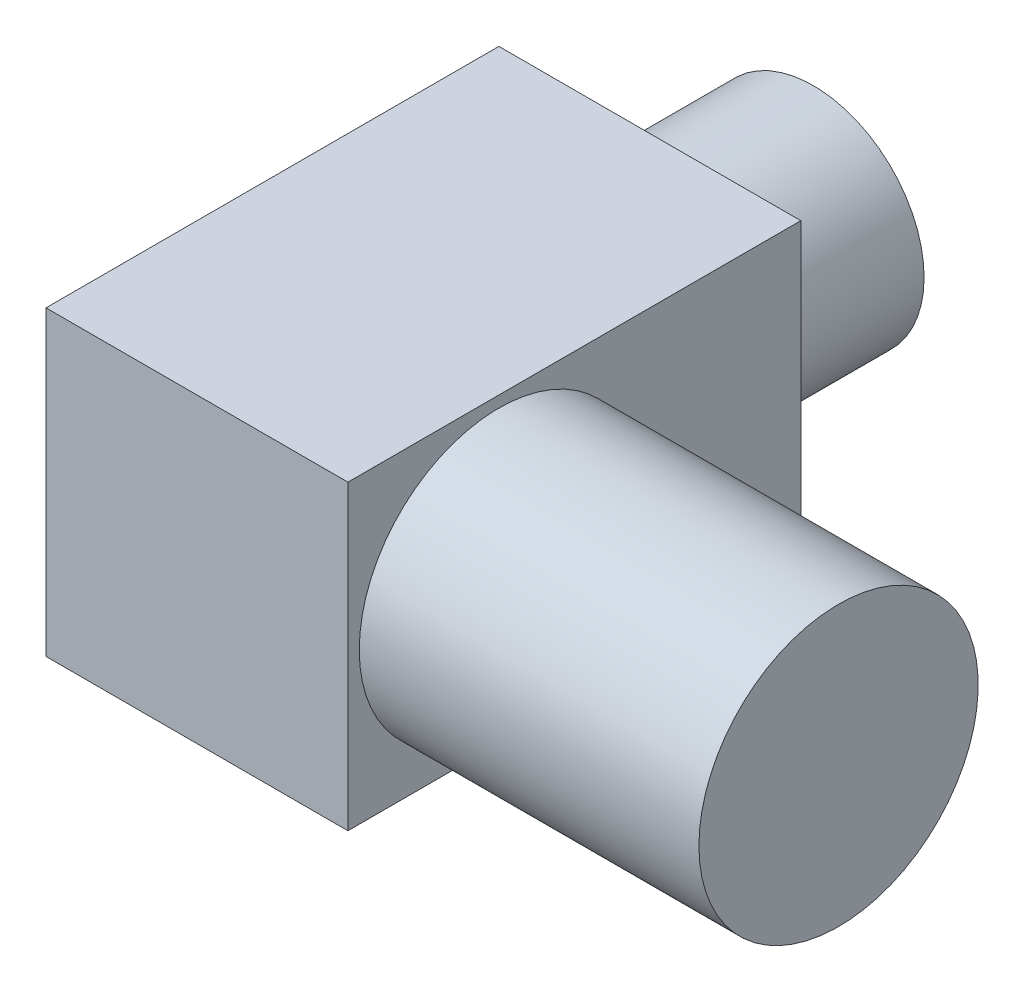
ISO-10303-21;
HEADER;
FILE_DESCRIPTION(('STEP AP214'),'2;1');
FILE_NAME('part.step','',(''),(''),'','','');
FILE_SCHEMA(('AUTOMOTIVE_DESIGN { 1 0 10303 214 1 1 1 1 }'));
ENDSEC;
DATA;
#1=APPLICATION_CONTEXT('core data for automotive mechanical design processes');
#2=APPLICATION_PROTOCOL_DEFINITION('international standard','automotive_design',2000,#1);
#3=PRODUCT_CONTEXT('',#1,'mechanical');
#4=PRODUCT('Part','Part','',(#3));
#5=PRODUCT_RELATED_PRODUCT_CATEGORY('part','',(#4));
#6=PRODUCT_DEFINITION_FORMATION('','',#4);
#7=PRODUCT_DEFINITION_CONTEXT('part definition',#1,'design');
#8=PRODUCT_DEFINITION('design','',#6,#7);
#9=PRODUCT_DEFINITION_SHAPE('','',#8);
#10=(LENGTH_UNIT() NAMED_UNIT(*) SI_UNIT(.MILLI.,.METRE.));
#11=(NAMED_UNIT(*) PLANE_ANGLE_UNIT() SI_UNIT($,.RADIAN.));
#12=(NAMED_UNIT(*) SI_UNIT($,.STERADIAN.) SOLID_ANGLE_UNIT());
#13=UNCERTAINTY_MEASURE_WITH_UNIT(LENGTH_MEASURE(1.E-05),#10,'distance_accuracy_value','');
#14=(GEOMETRIC_REPRESENTATION_CONTEXT(3) GLOBAL_UNCERTAINTY_ASSIGNED_CONTEXT((#13)) GLOBAL_UNIT_ASSIGNED_CONTEXT((#10,
#11,#12)) REPRESENTATION_CONTEXT('',''));
#15=CARTESIAN_POINT('',(0.,0.,0.));
#16=DIRECTION('',(0.,0.,1.));
#17=DIRECTION('',(1.,0.,0.));
#18=AXIS2_PLACEMENT_3D('',#15,#16,#17);
#19=CARTESIAN_POINT('',(0.,0.,0.));
#20=DIRECTION('',(0.,0.,-1.));
#21=DIRECTION('',(-1.,0.,0.));
#22=AXIS2_PLACEMENT_3D('',#19,#20,#21);
#23=CYLINDRICAL_SURFACE('',#22,4.4);
#24=CARTESIAN_POINT('',(0.,0.,0.));
#25=DIRECTION('',(0.,0.,1.));
#26=DIRECTION('',(1.,0.,0.));
#27=AXIS2_PLACEMENT_3D('',#24,#25,#26);
#28=CIRCLE('',#27,4.4);
#29=CARTESIAN_POINT('',(-4.4,0.,0.));
#30=VERTEX_POINT('',#29);
#31=EDGE_CURVE('E50',#30,#30,#28,.T.);
#32=CARTESIAN_POINT('',(0.,0.,-6.5));
#33=DIRECTION('',(0.,0.,1.));
#34=DIRECTION('',(1.,0.,0.));
#35=AXIS2_PLACEMENT_3D('',#32,#33,#34);
#36=CIRCLE('',#35,4.4);
#37=CARTESIAN_POINT('',(-4.4,0.,-6.5));
#38=VERTEX_POINT('',#37);
#39=EDGE_CURVE('E116',#38,#38,#36,.T.);
#40=CARTESIAN_POINT('',(-4.4,0.,0.));
#41=CARTESIAN_POINT('',(-4.4,0.,-0.0677083333333332));
#42=CARTESIAN_POINT('',(-4.4,0.,-0.135416666666667));
#43=CARTESIAN_POINT('',(-4.4,0.,-0.270833333333333));
#44=CARTESIAN_POINT('',(-4.4,0.,-0.338541666666667));
#45=CARTESIAN_POINT('',(-4.4,0.,-0.473958333333333));
#46=CARTESIAN_POINT('',(-4.4,0.,-0.541666666666667));
#47=CARTESIAN_POINT('',(-4.4,0.,-0.677083333333333));
#48=CARTESIAN_POINT('',(-4.4,0.,-0.744791666666667));
#49=CARTESIAN_POINT('',(-4.4,0.,-0.880208333333333));
#50=CARTESIAN_POINT('',(-4.4,0.,-0.947916666666667));
#51=CARTESIAN_POINT('',(-4.4,0.,-1.08333333333333));
#52=CARTESIAN_POINT('',(-4.4,0.,-1.15104166666667));
#53=CARTESIAN_POINT('',(-4.4,0.,-1.28645833333333));
#54=CARTESIAN_POINT('',(-4.4,0.,-1.35416666666667));
#55=CARTESIAN_POINT('',(-4.4,0.,-1.48958333333333));
#56=CARTESIAN_POINT('',(-4.4,0.,-1.55729166666667));
#57=CARTESIAN_POINT('',(-4.4,0.,-1.69270833333333));
#58=CARTESIAN_POINT('',(-4.4,0.,-1.76041666666667));
#59=CARTESIAN_POINT('',(-4.4,0.,-1.89583333333333));
#60=CARTESIAN_POINT('',(-4.4,0.,-1.96354166666667));
#61=CARTESIAN_POINT('',(-4.4,0.,-2.09895833333333));
#62=CARTESIAN_POINT('',(-4.4,0.,-2.16666666666667));
#63=CARTESIAN_POINT('',(-4.4,0.,-2.30208333333333));
#64=CARTESIAN_POINT('',(-4.4,0.,-2.36979166666667));
#65=CARTESIAN_POINT('',(-4.4,0.,-2.50520833333333));
#66=CARTESIAN_POINT('',(-4.4,0.,-2.57291666666667));
#67=CARTESIAN_POINT('',(-4.4,0.,-2.70833333333333));
#68=CARTESIAN_POINT('',(-4.4,0.,-2.77604166666667));
#69=CARTESIAN_POINT('',(-4.4,0.,-2.91145833333333));
#70=CARTESIAN_POINT('',(-4.4,0.,-2.97916666666667));
#71=CARTESIAN_POINT('',(-4.4,0.,-3.11458333333333));
#72=CARTESIAN_POINT('',(-4.4,0.,-3.18229166666667));
#73=CARTESIAN_POINT('',(-4.4,0.,-3.31770833333333));
#74=CARTESIAN_POINT('',(-4.4,0.,-3.38541666666667));
#75=CARTESIAN_POINT('',(-4.4,0.,-3.52083333333333));
#76=CARTESIAN_POINT('',(-4.4,0.,-3.58854166666667));
#77=CARTESIAN_POINT('',(-4.4,0.,-3.72395833333333));
#78=CARTESIAN_POINT('',(-4.4,0.,-3.79166666666667));
#79=CARTESIAN_POINT('',(-4.4,0.,-3.92708333333333));
#80=CARTESIAN_POINT('',(-4.4,0.,-3.99479166666667));
#81=CARTESIAN_POINT('',(-4.4,0.,-4.13020833333333));
#82=CARTESIAN_POINT('',(-4.4,0.,-4.19791666666667));
#83=CARTESIAN_POINT('',(-4.4,0.,-4.33333333333333));
#84=CARTESIAN_POINT('',(-4.4,0.,-4.40104166666667));
#85=CARTESIAN_POINT('',(-4.4,0.,-4.53645833333333));
#86=CARTESIAN_POINT('',(-4.4,0.,-4.60416666666667));
#87=CARTESIAN_POINT('',(-4.4,0.,-4.73958333333333));
#88=CARTESIAN_POINT('',(-4.4,0.,-4.80729166666667));
#89=CARTESIAN_POINT('',(-4.4,0.,-4.94270833333333));
#90=CARTESIAN_POINT('',(-4.4,0.,-5.01041666666667));
#91=CARTESIAN_POINT('',(-4.4,0.,-5.14583333333333));
#92=CARTESIAN_POINT('',(-4.4,0.,-5.21354166666667));
#93=CARTESIAN_POINT('',(-4.4,0.,-5.34895833333333));
#94=CARTESIAN_POINT('',(-4.4,0.,-5.41666666666667));
#95=CARTESIAN_POINT('',(-4.4,0.,-5.55208333333333));
#96=CARTESIAN_POINT('',(-4.4,0.,-5.61979166666667));
#97=CARTESIAN_POINT('',(-4.4,0.,-5.75520833333333));
#98=CARTESIAN_POINT('',(-4.4,0.,-5.82291666666667));
#99=CARTESIAN_POINT('',(-4.4,0.,-5.95833333333333));
#100=CARTESIAN_POINT('',(-4.4,0.,-6.02604166666667));
#101=CARTESIAN_POINT('',(-4.4,0.,-6.16145833333333));
#102=CARTESIAN_POINT('',(-4.4,0.,-6.22916666666667));
#103=CARTESIAN_POINT('',(-4.4,0.,-6.36458333333333));
#104=CARTESIAN_POINT('',(-4.4,0.,-6.43229166666667));
#105=CARTESIAN_POINT('',(-4.4,0.,-6.5));
#106=B_SPLINE_CURVE_WITH_KNOTS('',3,(#40,#41,#42,#43,#44,#45,#46,#47,#48,#49,#50,#51,#52,#53,
#54,#55,#56,#57,#58,#59,#60,#61,#62,#63,#64,#65,#66,#67,#68,#69,#70,#71,#72,#73,#74,#75,#76,#77,
#78,#79,#80,#81,#82,#83,#84,#85,#86,#87,#88,#89,#90,#91,#92,#93,#94,#95,#96,#97,#98,#99,#100,
#101,#102,#103,#104,#105),.UNSPECIFIED.,.F.,.F.,(4,2,2,2,2,2,2,2,2,2,2,2,2,2,2,2,2,2,2,2,2,2,2,
2,2,2,2,2,2,2,2,2,4),(0.,0.203125,0.40625,0.609375,0.8125,1.015625,1.21875,1.421875,1.625,
1.828125,2.03125,2.234375,2.4375,2.640625,2.84375,3.046875,3.25,3.453125,3.65625,3.859375,
4.0625,4.265625,4.46875,4.671875,4.875,5.078125,5.28125,5.484375,5.6875,5.890625,6.09375,
6.296875,6.5),.UNSPECIFIED.);
#107=EDGE_CURVE('BSEAM39',#30,#38,#106,.T.);
#108=ORIENTED_EDGE('',*,*,#31,.F.);
#109=ORIENTED_EDGE('',*,*,#39,.T.);
#110=ORIENTED_EDGE('',*,*,#107,.T.);
#111=ORIENTED_EDGE('',*,*,#107,.F.);
#112=EDGE_LOOP('',(#108,#110,#109,#111));
#113=FACE_BOUND('',#112,.T.);
#114=ADVANCED_FACE('F39',(#113),#23,.T.);
#115=CARTESIAN_POINT('',(0.,0.,-6.5));
#116=DIRECTION('',(0.,0.,1.));
#117=DIRECTION('',(1.,0.,0.));
#118=AXIS2_PLACEMENT_3D('',#115,#116,#117);
#119=PLANE('',#118);
#120=ORIENTED_EDGE('',*,*,#39,.F.);
#121=EDGE_LOOP('',(#120));
#122=FACE_BOUND('',#121,.T.);
#123=ADVANCED_FACE('F125',(#122),#119,.F.);
#124=CARTESIAN_POINT('',(-6.,6.,18.));
#125=DIRECTION('',(1.,0.,0.));
#126=DIRECTION('',(0.,0.,-1.));
#127=AXIS2_PLACEMENT_3D('',#124,#125,#126);
#128=PLANE('',#127);
#129=DIRECTION('',(0.,-1.,0.));
#130=VECTOR('',#129,1.);
#131=CARTESIAN_POINT('',(-6.,6.,0.));
#132=LINE('',#131,#130);
#133=CARTESIAN_POINT('',(-6.,6.,0.));
#134=VERTEX_POINT('',#133);
#135=CARTESIAN_POINT('',(-6.,-6.,0.));
#136=VERTEX_POINT('',#135);
#137=EDGE_CURVE('E106',#134,#136,#132,.T.);
#138=ORIENTED_EDGE('',*,*,#137,.T.);
#139=DIRECTION('',(0.,0.,-1.));
#140=VECTOR('',#139,1.);
#141=CARTESIAN_POINT('',(-6.,-6.,18.));
#142=LINE('',#141,#140);
#143=CARTESIAN_POINT('',(-6.,-6.,18.));
#144=VERTEX_POINT('',#143);
#145=EDGE_CURVE('E97',#144,#136,#142,.T.);
#146=ORIENTED_EDGE('',*,*,#145,.F.);
#147=DIRECTION('',(0.,-1.,0.));
#148=VECTOR('',#147,1.);
#149=CARTESIAN_POINT('',(-6.,6.,18.));
#150=LINE('',#149,#148);
#151=CARTESIAN_POINT('',(-6.,6.,18.));
#152=VERTEX_POINT('',#151);
#153=EDGE_CURVE('E92',#152,#144,#150,.T.);
#154=ORIENTED_EDGE('',*,*,#153,.F.);
#155=DIRECTION('',(0.,0.,-1.));
#156=VECTOR('',#155,1.);
#157=CARTESIAN_POINT('',(-6.,6.,18.));
#158=LINE('',#157,#156);
#159=EDGE_CURVE('E105',#152,#134,#158,.T.);
#160=ORIENTED_EDGE('',*,*,#159,.T.);
#161=EDGE_LOOP('',(#138,#146,#154,#160));
#162=FACE_BOUND('',#161,.T.);
#163=ADVANCED_FACE('F121',(#162),#128,.F.);
#164=CARTESIAN_POINT('',(-6.,-6.,18.));
#165=DIRECTION('',(0.,1.,0.));
#166=DIRECTION('',(0.,0.,1.));
#167=AXIS2_PLACEMENT_3D('',#164,#165,#166);
#168=PLANE('',#167);
#169=DIRECTION('',(1.,0.,0.));
#170=VECTOR('',#169,1.);
#171=CARTESIAN_POINT('',(-6.,-6.,0.));
#172=LINE('',#171,#170);
#173=CARTESIAN_POINT('',(6.,-6.,0.));
#174=VERTEX_POINT('',#173);
#175=EDGE_CURVE('E98',#136,#174,#172,.T.);
#176=ORIENTED_EDGE('',*,*,#175,.T.);
#177=DIRECTION('',(0.,0.,-1.));
#178=VECTOR('',#177,1.);
#179=CARTESIAN_POINT('',(6.,-6.,18.));
#180=LINE('',#179,#178);
#181=CARTESIAN_POINT('',(6.,-6.,18.));
#182=VERTEX_POINT('',#181);
#183=EDGE_CURVE('E91',#182,#174,#180,.T.);
#184=ORIENTED_EDGE('',*,*,#183,.F.);
#185=DIRECTION('',(1.,0.,0.));
#186=VECTOR('',#185,1.);
#187=CARTESIAN_POINT('',(-6.,-6.,18.));
#188=LINE('',#187,#186);
#189=EDGE_CURVE('E88',#144,#182,#188,.T.);
#190=ORIENTED_EDGE('',*,*,#189,.F.);
#191=ORIENTED_EDGE('',*,*,#145,.T.);
#192=EDGE_LOOP('',(#176,#184,#190,#191));
#193=FACE_BOUND('',#192,.T.);
#194=ADVANCED_FACE('F93',(#193),#168,.F.);
#195=CARTESIAN_POINT('',(6.,-6.,18.));
#196=DIRECTION('',(-1.,0.,0.));
#197=DIRECTION('',(0.,0.,1.));
#198=AXIS2_PLACEMENT_3D('',#195,#196,#197);
#199=PLANE('',#198);
#200=CARTESIAN_POINT('',(6.,0.,12.));
#201=DIRECTION('',(-1.,0.,0.));
#202=DIRECTION('',(0.,0.,1.));
#203=AXIS2_PLACEMENT_3D('',#200,#201,#202);
#204=CIRCLE('',#203,5.55);
#205=CARTESIAN_POINT('',(6.,0.,17.55));
#206=VERTEX_POINT('',#205);
#207=EDGE_CURVE('E11',#206,#206,#204,.F.);
#208=ORIENTED_EDGE('',*,*,#207,.F.);
#209=EDGE_LOOP('',(#208));
#210=FACE_BOUND('',#209,.T.);
#211=DIRECTION('',(0.,1.,0.));
#212=VECTOR('',#211,1.);
#213=CARTESIAN_POINT('',(6.,-6.,0.));
#214=LINE('',#213,#212);
#215=CARTESIAN_POINT('',(6.,6.,0.));
#216=VERTEX_POINT('',#215);
#217=EDGE_CURVE('E74',#174,#216,#214,.T.);
#218=ORIENTED_EDGE('',*,*,#217,.T.);
#219=DIRECTION('',(0.,0.,-1.));
#220=VECTOR('',#219,1.);
#221=CARTESIAN_POINT('',(6.,6.,18.));
#222=LINE('',#221,#220);
#223=CARTESIAN_POINT('',(6.,6.,18.));
#224=VERTEX_POINT('',#223);
#225=EDGE_CURVE('E96',#224,#216,#222,.T.);
#226=ORIENTED_EDGE('',*,*,#225,.F.);
#227=DIRECTION('',(0.,1.,0.));
#228=VECTOR('',#227,1.);
#229=CARTESIAN_POINT('',(6.,-6.,18.));
#230=LINE('',#229,#228);
#231=EDGE_CURVE('E89',#182,#224,#230,.T.);
#232=ORIENTED_EDGE('',*,*,#231,.F.);
#233=ORIENTED_EDGE('',*,*,#183,.T.);
#234=EDGE_LOOP('',(#218,#226,#232,#233));
#235=FACE_BOUND('',#234,.T.);
#236=ADVANCED_FACE('F99',(#210,#235),#199,.F.);
#237=CARTESIAN_POINT('',(6.,6.,18.));
#238=DIRECTION('',(0.,-1.,0.));
#239=DIRECTION('',(0.,0.,-1.));
#240=AXIS2_PLACEMENT_3D('',#237,#238,#239);
#241=PLANE('',#240);
#242=DIRECTION('',(-1.,0.,0.));
#243=VECTOR('',#242,1.);
#244=CARTESIAN_POINT('',(6.,6.,0.));
#245=LINE('',#244,#243);
#246=EDGE_CURVE('E76',#216,#134,#245,.T.);
#247=ORIENTED_EDGE('',*,*,#246,.T.);
#248=ORIENTED_EDGE('',*,*,#159,.F.);
#249=DIRECTION('',(-1.,0.,0.));
#250=VECTOR('',#249,1.);
#251=CARTESIAN_POINT('',(6.,6.,18.));
#252=LINE('',#251,#250);
#253=EDGE_CURVE('E54',#224,#152,#252,.T.);
#254=ORIENTED_EDGE('',*,*,#253,.F.);
#255=ORIENTED_EDGE('',*,*,#225,.T.);
#256=EDGE_LOOP('',(#247,#248,#254,#255));
#257=FACE_BOUND('',#256,.T.);
#258=ADVANCED_FACE('F139',(#257),#241,.F.);
#259=CARTESIAN_POINT('',(0.,0.,18.));
#260=DIRECTION('',(0.,0.,1.));
#261=DIRECTION('',(1.,0.,0.));
#262=AXIS2_PLACEMENT_3D('',#259,#260,#261);
#263=PLANE('',#262);
#264=ORIENTED_EDGE('',*,*,#153,.T.);
#265=ORIENTED_EDGE('',*,*,#189,.T.);
#266=ORIENTED_EDGE('',*,*,#231,.T.);
#267=ORIENTED_EDGE('',*,*,#253,.T.);
#268=EDGE_LOOP('',(#264,#265,#266,#267));
#269=FACE_BOUND('',#268,.T.);
#270=ADVANCED_FACE('F90',(#269),#263,.T.);
#271=CARTESIAN_POINT('',(0.,0.,0.));
#272=DIRECTION('',(0.,0.,1.));
#273=DIRECTION('',(1.,0.,0.));
#274=AXIS2_PLACEMENT_3D('',#271,#272,#273);
#275=PLANE('',#274);
#276=ORIENTED_EDGE('',*,*,#31,.T.);
#277=EDGE_LOOP('',(#276));
#278=FACE_BOUND('',#277,.T.);
#279=ORIENTED_EDGE('',*,*,#137,.F.);
#280=ORIENTED_EDGE('',*,*,#246,.F.);
#281=ORIENTED_EDGE('',*,*,#217,.F.);
#282=ORIENTED_EDGE('',*,*,#175,.F.);
#283=EDGE_LOOP('',(#279,#280,#281,#282));
#284=FACE_BOUND('',#283,.T.);
#285=ADVANCED_FACE('F142',(#278,#284),#275,.F.);
#286=CARTESIAN_POINT('',(19.5,0.,12.));
#287=DIRECTION('',(-1.,0.,0.));
#288=DIRECTION('',(0.,0.,1.));
#289=AXIS2_PLACEMENT_3D('',#286,#287,#288);
#290=CYLINDRICAL_SURFACE('',#289,5.55);
#291=CARTESIAN_POINT('',(19.5,0.,12.));
#292=DIRECTION('',(1.,0.,0.));
#293=DIRECTION('',(0.,0.,-1.));
#294=AXIS2_PLACEMENT_3D('',#291,#292,#293);
#295=CIRCLE('',#294,5.55);
#296=CARTESIAN_POINT('',(19.5,0.,17.55));
#297=VERTEX_POINT('',#296);
#298=EDGE_CURVE('E107',#297,#297,#295,.T.);
#299=CARTESIAN_POINT('',(19.5,0.,17.55));
#300=CARTESIAN_POINT('',(19.359375,0.,17.55));
#301=CARTESIAN_POINT('',(19.21875,0.,17.55));
#302=CARTESIAN_POINT('',(18.9375,0.,17.55));
#303=CARTESIAN_POINT('',(18.796875,0.,17.55));
#304=CARTESIAN_POINT('',(18.515625,0.,17.55));
#305=CARTESIAN_POINT('',(18.375,0.,17.55));
#306=CARTESIAN_POINT('',(18.09375,0.,17.55));
#307=CARTESIAN_POINT('',(17.953125,0.,17.55));
#308=CARTESIAN_POINT('',(17.671875,0.,17.55));
#309=CARTESIAN_POINT('',(17.53125,0.,17.55));
#310=CARTESIAN_POINT('',(17.25,0.,17.55));
#311=CARTESIAN_POINT('',(17.109375,0.,17.55));
#312=CARTESIAN_POINT('',(16.828125,0.,17.55));
#313=CARTESIAN_POINT('',(16.6875,0.,17.55));
#314=CARTESIAN_POINT('',(16.40625,0.,17.55));
#315=CARTESIAN_POINT('',(16.265625,0.,17.55));
#316=CARTESIAN_POINT('',(15.984375,0.,17.55));
#317=CARTESIAN_POINT('',(15.84375,0.,17.55));
#318=CARTESIAN_POINT('',(15.5625,0.,17.55));
#319=CARTESIAN_POINT('',(15.421875,0.,17.55));
#320=CARTESIAN_POINT('',(15.140625,0.,17.55));
#321=CARTESIAN_POINT('',(15.,0.,17.55));
#322=CARTESIAN_POINT('',(14.71875,0.,17.55));
#323=CARTESIAN_POINT('',(14.578125,0.,17.55));
#324=CARTESIAN_POINT('',(14.296875,0.,17.55));
#325=CARTESIAN_POINT('',(14.15625,0.,17.55));
#326=CARTESIAN_POINT('',(13.875,0.,17.55));
#327=CARTESIAN_POINT('',(13.734375,0.,17.55));
#328=CARTESIAN_POINT('',(13.453125,0.,17.55));
#329=CARTESIAN_POINT('',(13.3125,0.,17.55));
#330=CARTESIAN_POINT('',(13.03125,0.,17.55));
#331=CARTESIAN_POINT('',(12.890625,0.,17.55));
#332=CARTESIAN_POINT('',(12.609375,0.,17.55));
#333=CARTESIAN_POINT('',(12.46875,0.,17.55));
#334=CARTESIAN_POINT('',(12.1875,0.,17.55));
#335=CARTESIAN_POINT('',(12.046875,0.,17.55));
#336=CARTESIAN_POINT('',(11.765625,0.,17.55));
#337=CARTESIAN_POINT('',(11.625,0.,17.55));
#338=CARTESIAN_POINT('',(11.34375,0.,17.55));
#339=CARTESIAN_POINT('',(11.203125,0.,17.55));
#340=CARTESIAN_POINT('',(10.921875,0.,17.55));
#341=CARTESIAN_POINT('',(10.78125,0.,17.55));
#342=CARTESIAN_POINT('',(10.5,0.,17.55));
#343=CARTESIAN_POINT('',(10.359375,0.,17.55));
#344=CARTESIAN_POINT('',(10.078125,0.,17.55));
#345=CARTESIAN_POINT('',(9.9375,0.,17.55));
#346=CARTESIAN_POINT('',(9.65625,0.,17.55));
#347=CARTESIAN_POINT('',(9.515625,0.,17.55));
#348=CARTESIAN_POINT('',(9.234375,0.,17.55));
#349=CARTESIAN_POINT('',(9.09375,0.,17.55));
#350=CARTESIAN_POINT('',(8.8125,0.,17.55));
#351=CARTESIAN_POINT('',(8.671875,0.,17.55));
#352=CARTESIAN_POINT('',(8.390625,0.,17.55));
#353=CARTESIAN_POINT('',(8.25,0.,17.55));
#354=CARTESIAN_POINT('',(7.96875,0.,17.55));
#355=CARTESIAN_POINT('',(7.828125,0.,17.55));
#356=CARTESIAN_POINT('',(7.546875,0.,17.55));
#357=CARTESIAN_POINT('',(7.40625,0.,17.55));
#358=CARTESIAN_POINT('',(7.125,0.,17.55));
#359=CARTESIAN_POINT('',(6.984375,0.,17.55));
#360=CARTESIAN_POINT('',(6.703125,0.,17.55));
#361=CARTESIAN_POINT('',(6.5625,0.,17.55));
#362=CARTESIAN_POINT('',(6.28125,0.,17.55));
#363=CARTESIAN_POINT('',(6.140625,0.,17.55));
#364=CARTESIAN_POINT('',(6.,0.,17.55));
#365=B_SPLINE_CURVE_WITH_KNOTS('',3,(#299,#300,#301,#302,#303,#304,#305,#306,#307,#308,#309,
#310,#311,#312,#313,#314,#315,#316,#317,#318,#319,#320,#321,#322,#323,#324,#325,#326,#327,#328,
#329,#330,#331,#332,#333,#334,#335,#336,#337,#338,#339,#340,#341,#342,#343,#344,#345,#346,#347,
#348,#349,#350,#351,#352,#353,#354,#355,#356,#357,#358,#359,#360,#361,#362,#363,#364),
.UNSPECIFIED.,.F.,.F.,(4,2,2,2,2,2,2,2,2,2,2,2,2,2,2,2,2,2,2,2,2,2,2,2,2,2,2,2,2,2,2,2,4),(0.,
0.421874999999999,0.843749999999997,1.265625,1.6875,2.109375,2.53125,2.953125,3.375,3.796875,
4.21875,4.640625,5.0625,5.484375,5.90624999999999,6.328125,6.75,7.17187499999999,7.59375,
8.01562499999999,8.43749999999999,8.85937499999999,9.28124999999999,9.70312499999999,10.125,
10.546875,10.96875,11.390625,11.8125,12.234375,12.65625,13.078125,13.5),.UNSPECIFIED.);
#366=EDGE_CURVE('BSEAM144',#297,#206,#365,.T.);
#367=ORIENTED_EDGE('',*,*,#298,.F.);
#368=ORIENTED_EDGE('',*,*,#207,.T.);
#369=ORIENTED_EDGE('',*,*,#366,.T.);
#370=ORIENTED_EDGE('',*,*,#366,.F.);
#371=EDGE_LOOP('',(#367,#369,#368,#370));
#372=FACE_BOUND('',#371,.T.);
#373=ADVANCED_FACE('F144',(#372),#290,.T.);
#374=CARTESIAN_POINT('',(19.5,0.,12.));
#375=DIRECTION('',(1.,0.,0.));
#376=DIRECTION('',(0.,0.,-1.));
#377=AXIS2_PLACEMENT_3D('',#374,#375,#376);
#378=PLANE('',#377);
#379=ORIENTED_EDGE('',*,*,#298,.T.);
#380=EDGE_LOOP('',(#379));
#381=FACE_BOUND('',#380,.T.);
#382=ADVANCED_FACE('F147',(#381),#378,.T.);
#383=CLOSED_SHELL('',(#114,#123,#163,#194,#236,#258,#270,#285,#373,#382));
#384=MANIFOLD_SOLID_BREP('B2',#383);
#385=ADVANCED_BREP_SHAPE_REPRESENTATION('',(#18,#384),#14);
#386=SHAPE_DEFINITION_REPRESENTATION(#9,#385);
ENDSEC;
END-ISO-10303-21;
